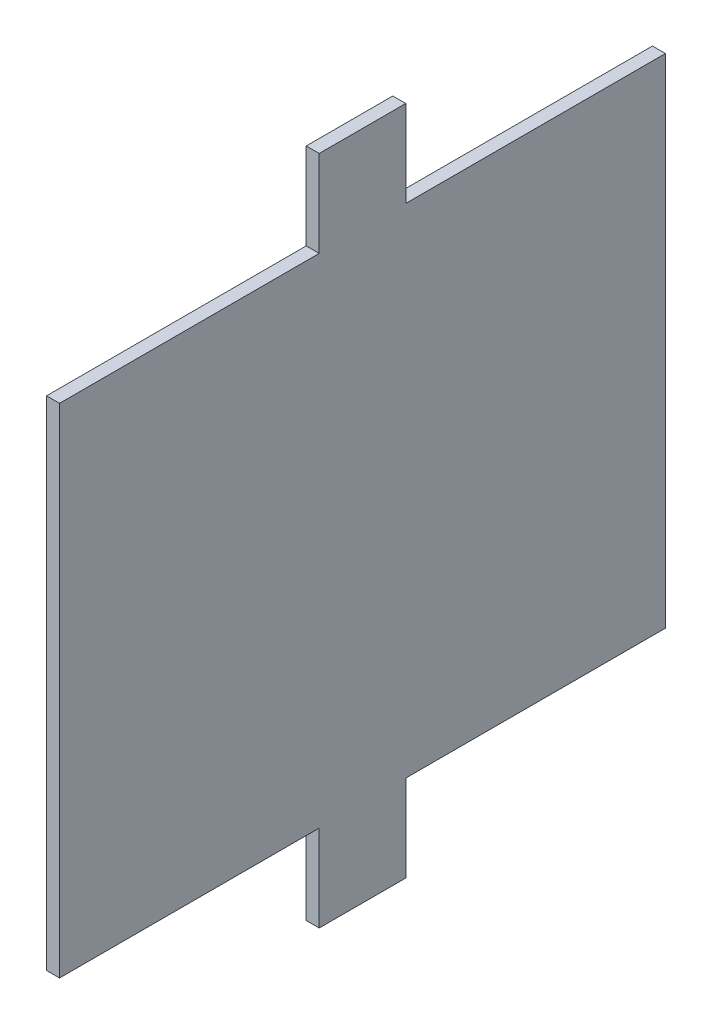
ISO-10303-21;
HEADER;
FILE_DESCRIPTION(('STEP AP214'),'2;1');
FILE_NAME('part.step','',(''),(''),'','','');
FILE_SCHEMA(('AUTOMOTIVE_DESIGN { 1 0 10303 214 1 1 1 1 }'));
ENDSEC;
DATA;
#1=APPLICATION_CONTEXT('core data for automotive mechanical design processes');
#2=APPLICATION_PROTOCOL_DEFINITION('international standard','automotive_design',2000,#1);
#3=PRODUCT_CONTEXT('',#1,'mechanical');
#4=PRODUCT('Part','Part','',(#3));
#5=PRODUCT_RELATED_PRODUCT_CATEGORY('part','',(#4));
#6=PRODUCT_DEFINITION_FORMATION('','',#4);
#7=PRODUCT_DEFINITION_CONTEXT('part definition',#1,'design');
#8=PRODUCT_DEFINITION('design','',#6,#7);
#9=PRODUCT_DEFINITION_SHAPE('','',#8);
#10=(LENGTH_UNIT() NAMED_UNIT(*) SI_UNIT(.MILLI.,.METRE.));
#11=(NAMED_UNIT(*) PLANE_ANGLE_UNIT() SI_UNIT($,.RADIAN.));
#12=(NAMED_UNIT(*) SI_UNIT($,.STERADIAN.) SOLID_ANGLE_UNIT());
#13=UNCERTAINTY_MEASURE_WITH_UNIT(LENGTH_MEASURE(1.E-05),#10,'distance_accuracy_value','');
#14=(GEOMETRIC_REPRESENTATION_CONTEXT(3) GLOBAL_UNCERTAINTY_ASSIGNED_CONTEXT((#13)) GLOBAL_UNIT_ASSIGNED_CONTEXT((#10,
#11,#12)) REPRESENTATION_CONTEXT('',''));
#15=CARTESIAN_POINT('',(0.,0.,0.));
#16=DIRECTION('',(0.,0.,1.));
#17=DIRECTION('',(1.,0.,0.));
#18=AXIS2_PLACEMENT_3D('',#15,#16,#17);
#19=CARTESIAN_POINT('',(3.81,200.822843489905,154.488603488026));
#20=DIRECTION('',(0.,0.,-1.));
#21=DIRECTION('',(-1.,0.,0.));
#22=AXIS2_PLACEMENT_3D('',#19,#20,#21);
#23=PLANE('',#22);
#24=DIRECTION('',(0.,-1.,0.));
#25=VECTOR('',#24,1.);
#26=CARTESIAN_POINT('',(-3.81,200.822843489905,154.488603488026));
#27=LINE('',#26,#25);
#28=CARTESIAN_POINT('',(-3.81,200.822843489905,154.488603488026));
#29=VERTEX_POINT('',#28);
#30=CARTESIAN_POINT('',(-3.81,-91.2771565100952,154.488603488026));
#31=VERTEX_POINT('',#30);
#32=EDGE_CURVE('E164',#29,#31,#27,.T.);
#33=ORIENTED_EDGE('',*,*,#32,.T.);
#34=DIRECTION('',(-1.,0.,0.));
#35=VECTOR('',#34,1.);
#36=CARTESIAN_POINT('',(3.81,-91.2771565100952,154.488603488026));
#37=LINE('',#36,#35);
#38=CARTESIAN_POINT('',(3.81,-91.2771565100952,154.488603488026));
#39=VERTEX_POINT('',#38);
#40=EDGE_CURVE('E11',#39,#31,#37,.T.);
#41=ORIENTED_EDGE('',*,*,#40,.F.);
#42=DIRECTION('',(0.,-1.,0.));
#43=VECTOR('',#42,1.);
#44=CARTESIAN_POINT('',(3.81,200.822843489905,154.488603488026));
#45=LINE('',#44,#43);
#46=CARTESIAN_POINT('',(3.81,200.822843489905,154.488603488026));
#47=VERTEX_POINT('',#46);
#48=EDGE_CURVE('E198',#47,#39,#45,.T.);
#49=ORIENTED_EDGE('',*,*,#48,.F.);
#50=DIRECTION('',(-1.,0.,0.));
#51=VECTOR('',#50,1.);
#52=CARTESIAN_POINT('',(3.81,200.822843489905,154.488603488026));
#53=LINE('',#52,#51);
#54=EDGE_CURVE('E160',#47,#29,#53,.T.);
#55=ORIENTED_EDGE('',*,*,#54,.T.);
#56=EDGE_LOOP('',(#33,#41,#49,#55));
#57=FACE_BOUND('',#56,.T.);
#58=ADVANCED_FACE('F39',(#57),#23,.F.);
#59=CARTESIAN_POINT('',(3.81,-91.2771565100952,154.488603488026));
#60=DIRECTION('',(0.,1.,0.));
#61=DIRECTION('',(0.,0.,1.));
#62=AXIS2_PLACEMENT_3D('',#59,#60,#61);
#63=PLANE('',#62);
#64=DIRECTION('',(0.,0.,-1.));
#65=VECTOR('',#64,1.);
#66=CARTESIAN_POINT('',(-3.81,-91.2771565100952,154.488603488026));
#67=LINE('',#66,#65);
#68=CARTESIAN_POINT('',(-3.81,-91.2771565100952,2.08860348802573));
#69=VERTEX_POINT('',#68);
#70=EDGE_CURVE('E168',#31,#69,#67,.T.);
#71=ORIENTED_EDGE('',*,*,#70,.T.);
#72=DIRECTION('',(-1.,0.,0.));
#73=VECTOR('',#72,1.);
#74=CARTESIAN_POINT('',(3.81,-91.2771565100952,2.08860348802573));
#75=LINE('',#74,#73);
#76=CARTESIAN_POINT('',(3.81,-91.2771565100952,2.08860348802573));
#77=VERTEX_POINT('',#76);
#78=EDGE_CURVE('E48',#77,#69,#75,.T.);
#79=ORIENTED_EDGE('',*,*,#78,.F.);
#80=DIRECTION('',(0.,0.,-1.));
#81=VECTOR('',#80,1.);
#82=CARTESIAN_POINT('',(3.81,-91.2771565100952,154.488603488026));
#83=LINE('',#82,#81);
#84=EDGE_CURVE('E111',#39,#77,#83,.T.);
#85=ORIENTED_EDGE('',*,*,#84,.F.);
#86=ORIENTED_EDGE('',*,*,#40,.T.);
#87=EDGE_LOOP('',(#71,#79,#85,#86));
#88=FACE_BOUND('',#87,.T.);
#89=ADVANCED_FACE('F292',(#88),#63,.F.);
#90=CARTESIAN_POINT('',(3.81,-142.077156510095,2.08860348802573));
#91=DIRECTION('',(0.,0.,-1.));
#92=DIRECTION('',(-1.,0.,0.));
#93=AXIS2_PLACEMENT_3D('',#90,#91,#92);
#94=PLANE('',#93);
#95=DIRECTION('',(0.,-1.,0.));
#96=VECTOR('',#95,1.);
#97=CARTESIAN_POINT('',(-3.81,-142.077156510095,2.08860348802573));
#98=LINE('',#97,#96);
#99=CARTESIAN_POINT('',(-3.81,-142.077156510095,2.08860348802573));
#100=VERTEX_POINT('',#99);
#101=EDGE_CURVE('E171',#69,#100,#98,.T.);
#102=ORIENTED_EDGE('',*,*,#101,.T.);
#103=DIRECTION('',(-1.,0.,0.));
#104=VECTOR('',#103,1.);
#105=CARTESIAN_POINT('',(3.81,-142.077156510095,2.08860348802573));
#106=LINE('',#105,#104);
#107=CARTESIAN_POINT('',(3.81,-142.077156510095,2.08860348802573));
#108=VERTEX_POINT('',#107);
#109=EDGE_CURVE('E225',#108,#100,#106,.T.);
#110=ORIENTED_EDGE('',*,*,#109,.F.);
#111=DIRECTION('',(0.,-1.,0.));
#112=VECTOR('',#111,1.);
#113=CARTESIAN_POINT('',(3.81,-142.077156510095,2.08860348802573));
#114=LINE('',#113,#112);
#115=EDGE_CURVE('E235',#77,#108,#114,.T.);
#116=ORIENTED_EDGE('',*,*,#115,.F.);
#117=ORIENTED_EDGE('',*,*,#78,.T.);
#118=EDGE_LOOP('',(#102,#110,#116,#117));
#119=FACE_BOUND('',#118,.T.);
#120=ADVANCED_FACE('F233',(#119),#94,.F.);
#121=CARTESIAN_POINT('',(3.81,-142.077156510095,-48.7113965119743));
#122=DIRECTION('',(0.,1.,0.));
#123=DIRECTION('',(0.,0.,1.));
#124=AXIS2_PLACEMENT_3D('',#121,#122,#123);
#125=PLANE('',#124);
#126=DIRECTION('',(0.,0.,-1.));
#127=VECTOR('',#126,1.);
#128=CARTESIAN_POINT('',(-3.81,-142.077156510095,-48.7113965119743));
#129=LINE('',#128,#127);
#130=CARTESIAN_POINT('',(-3.81,-142.077156510095,-48.7113965119743));
#131=VERTEX_POINT('',#130);
#132=EDGE_CURVE('E174',#100,#131,#129,.T.);
#133=ORIENTED_EDGE('',*,*,#132,.T.);
#134=DIRECTION('',(-1.,0.,0.));
#135=VECTOR('',#134,1.);
#136=CARTESIAN_POINT('',(3.81,-142.077156510095,-48.7113965119743));
#137=LINE('',#136,#135);
#138=CARTESIAN_POINT('',(3.81,-142.077156510095,-48.7113965119743));
#139=VERTEX_POINT('',#138);
#140=EDGE_CURVE('E221',#139,#131,#137,.T.);
#141=ORIENTED_EDGE('',*,*,#140,.F.);
#142=DIRECTION('',(0.,0.,-1.));
#143=VECTOR('',#142,1.);
#144=CARTESIAN_POINT('',(3.81,-142.077156510095,-48.7113965119743));
#145=LINE('',#144,#143);
#146=EDGE_CURVE('E254',#108,#139,#145,.T.);
#147=ORIENTED_EDGE('',*,*,#146,.F.);
#148=ORIENTED_EDGE('',*,*,#109,.T.);
#149=EDGE_LOOP('',(#133,#141,#147,#148));
#150=FACE_BOUND('',#149,.T.);
#151=ADVANCED_FACE('F244',(#150),#125,.F.);
#152=CARTESIAN_POINT('',(3.81,-91.2771565100952,-48.7113965119743));
#153=DIRECTION('',(0.,0.,1.));
#154=DIRECTION('',(0.,-1.,0.));
#155=AXIS2_PLACEMENT_3D('',#152,#153,#154);
#156=PLANE('',#155);
#157=DIRECTION('',(0.,1.,0.));
#158=VECTOR('',#157,1.);
#159=CARTESIAN_POINT('',(-3.81,-91.2771565100952,-48.7113965119743));
#160=LINE('',#159,#158);
#161=CARTESIAN_POINT('',(-3.81,-91.2771565100952,-48.7113965119743));
#162=VERTEX_POINT('',#161);
#163=EDGE_CURVE('E177',#131,#162,#160,.T.);
#164=ORIENTED_EDGE('',*,*,#163,.T.);
#165=DIRECTION('',(-1.,0.,0.));
#166=VECTOR('',#165,1.);
#167=CARTESIAN_POINT('',(3.81,-91.2771565100952,-48.7113965119743));
#168=LINE('',#167,#166);
#169=CARTESIAN_POINT('',(3.81,-91.2771565100952,-48.7113965119743));
#170=VERTEX_POINT('',#169);
#171=EDGE_CURVE('E217',#170,#162,#168,.T.);
#172=ORIENTED_EDGE('',*,*,#171,.F.);
#173=DIRECTION('',(0.,1.,0.));
#174=VECTOR('',#173,1.);
#175=CARTESIAN_POINT('',(3.81,-91.2771565100952,-48.7113965119743));
#176=LINE('',#175,#174);
#177=EDGE_CURVE('E250',#139,#170,#176,.T.);
#178=ORIENTED_EDGE('',*,*,#177,.F.);
#179=ORIENTED_EDGE('',*,*,#140,.T.);
#180=EDGE_LOOP('',(#164,#172,#178,#179));
#181=FACE_BOUND('',#180,.T.);
#182=ADVANCED_FACE('F248',(#181),#156,.F.);
#183=CARTESIAN_POINT('',(3.81,-91.2771565100952,-48.7113965119743));
#184=DIRECTION('',(0.,1.,0.));
#185=DIRECTION('',(0.,0.,1.));
#186=AXIS2_PLACEMENT_3D('',#183,#184,#185);
#187=PLANE('',#186);
#188=DIRECTION('',(0.,0.,-1.));
#189=VECTOR('',#188,1.);
#190=CARTESIAN_POINT('',(-3.81,-91.2771565100952,-48.7113965119743));
#191=LINE('',#190,#189);
#192=CARTESIAN_POINT('',(-3.81,-91.2771565100952,-201.111396511974));
#193=VERTEX_POINT('',#192);
#194=EDGE_CURVE('E180',#162,#193,#191,.T.);
#195=ORIENTED_EDGE('',*,*,#194,.T.);
#196=DIRECTION('',(-1.,0.,0.));
#197=VECTOR('',#196,1.);
#198=CARTESIAN_POINT('',(3.81,-91.2771565100952,-201.111396511974));
#199=LINE('',#198,#197);
#200=CARTESIAN_POINT('',(3.81,-91.2771565100952,-201.111396511974));
#201=VERTEX_POINT('',#200);
#202=EDGE_CURVE('E213',#201,#193,#199,.T.);
#203=ORIENTED_EDGE('',*,*,#202,.F.);
#204=DIRECTION('',(0.,0.,-1.));
#205=VECTOR('',#204,1.);
#206=CARTESIAN_POINT('',(3.81,-91.2771565100952,-48.7113965119743));
#207=LINE('',#206,#205);
#208=EDGE_CURVE('E253',#170,#201,#207,.T.);
#209=ORIENTED_EDGE('',*,*,#208,.F.);
#210=ORIENTED_EDGE('',*,*,#171,.T.);
#211=EDGE_LOOP('',(#195,#203,#209,#210));
#212=FACE_BOUND('',#211,.T.);
#213=ADVANCED_FACE('F305',(#212),#187,.F.);
#214=CARTESIAN_POINT('',(3.81,200.822843489905,-201.111396511974));
#215=DIRECTION('',(0.,0.,1.));
#216=DIRECTION('',(0.,-1.,0.));
#217=AXIS2_PLACEMENT_3D('',#214,#215,#216);
#218=PLANE('',#217);
#219=DIRECTION('',(0.,1.,0.));
#220=VECTOR('',#219,1.);
#221=CARTESIAN_POINT('',(-3.81,200.822843489905,-201.111396511974));
#222=LINE('',#221,#220);
#223=CARTESIAN_POINT('',(-3.81,200.822843489905,-201.111396511974));
#224=VERTEX_POINT('',#223);
#225=EDGE_CURVE('E183',#193,#224,#222,.T.);
#226=ORIENTED_EDGE('',*,*,#225,.T.);
#227=DIRECTION('',(-1.,0.,0.));
#228=VECTOR('',#227,1.);
#229=CARTESIAN_POINT('',(3.81,200.822843489905,-201.111396511974));
#230=LINE('',#229,#228);
#231=CARTESIAN_POINT('',(3.81,200.822843489905,-201.111396511974));
#232=VERTEX_POINT('',#231);
#233=EDGE_CURVE('E209',#232,#224,#230,.T.);
#234=ORIENTED_EDGE('',*,*,#233,.F.);
#235=DIRECTION('',(0.,1.,0.));
#236=VECTOR('',#235,1.);
#237=CARTESIAN_POINT('',(3.81,200.822843489905,-201.111396511974));
#238=LINE('',#237,#236);
#239=EDGE_CURVE('E258',#201,#232,#238,.T.);
#240=ORIENTED_EDGE('',*,*,#239,.F.);
#241=ORIENTED_EDGE('',*,*,#202,.T.);
#242=EDGE_LOOP('',(#226,#234,#240,#241));
#243=FACE_BOUND('',#242,.T.);
#244=ADVANCED_FACE('F308',(#243),#218,.F.);
#245=CARTESIAN_POINT('',(3.81,200.822843489905,-48.7113965119742));
#246=DIRECTION('',(0.,-1.,0.));
#247=DIRECTION('',(0.,0.,-1.));
#248=AXIS2_PLACEMENT_3D('',#245,#246,#247);
#249=PLANE('',#248);
#250=DIRECTION('',(0.,0.,1.));
#251=VECTOR('',#250,1.);
#252=CARTESIAN_POINT('',(-3.81,200.822843489905,-48.7113965119742));
#253=LINE('',#252,#251);
#254=CARTESIAN_POINT('',(-3.81,200.822843489905,-48.7113965119742));
#255=VERTEX_POINT('',#254);
#256=EDGE_CURVE('E186',#224,#255,#253,.T.);
#257=ORIENTED_EDGE('',*,*,#256,.T.);
#258=DIRECTION('',(-1.,0.,0.));
#259=VECTOR('',#258,1.);
#260=CARTESIAN_POINT('',(3.81,200.822843489905,-48.7113965119742));
#261=LINE('',#260,#259);
#262=CARTESIAN_POINT('',(3.81,200.822843489905,-48.7113965119742));
#263=VERTEX_POINT('',#262);
#264=EDGE_CURVE('E205',#263,#255,#261,.T.);
#265=ORIENTED_EDGE('',*,*,#264,.F.);
#266=DIRECTION('',(0.,0.,1.));
#267=VECTOR('',#266,1.);
#268=CARTESIAN_POINT('',(3.81,200.822843489905,-48.7113965119742));
#269=LINE('',#268,#267);
#270=EDGE_CURVE('E265',#232,#263,#269,.T.);
#271=ORIENTED_EDGE('',*,*,#270,.F.);
#272=ORIENTED_EDGE('',*,*,#233,.T.);
#273=EDGE_LOOP('',(#257,#265,#271,#272));
#274=FACE_BOUND('',#273,.T.);
#275=ADVANCED_FACE('F273',(#274),#249,.F.);
#276=CARTESIAN_POINT('',(3.81,200.822843489905,-48.7113965119742));
#277=DIRECTION('',(0.,0.,1.));
#278=DIRECTION('',(1.,0.,0.));
#279=AXIS2_PLACEMENT_3D('',#276,#277,#278);
#280=PLANE('',#279);
#281=DIRECTION('',(0.,1.,0.));
#282=VECTOR('',#281,1.);
#283=CARTESIAN_POINT('',(-3.81,200.822843489905,-48.7113965119742));
#284=LINE('',#283,#282);
#285=CARTESIAN_POINT('',(-3.81,251.622843489905,-48.7113965119742));
#286=VERTEX_POINT('',#285);
#287=EDGE_CURVE('E189',#255,#286,#284,.T.);
#288=ORIENTED_EDGE('',*,*,#287,.T.);
#289=DIRECTION('',(-1.,0.,0.));
#290=VECTOR('',#289,1.);
#291=CARTESIAN_POINT('',(3.81,251.622843489905,-48.7113965119742));
#292=LINE('',#291,#290);
#293=CARTESIAN_POINT('',(3.81,251.622843489905,-48.7113965119742));
#294=VERTEX_POINT('',#293);
#295=EDGE_CURVE('E153',#294,#286,#292,.T.);
#296=ORIENTED_EDGE('',*,*,#295,.F.);
#297=DIRECTION('',(0.,1.,0.));
#298=VECTOR('',#297,1.);
#299=CARTESIAN_POINT('',(3.81,200.822843489905,-48.7113965119742));
#300=LINE('',#299,#298);
#301=EDGE_CURVE('E142',#263,#294,#300,.T.);
#302=ORIENTED_EDGE('',*,*,#301,.F.);
#303=ORIENTED_EDGE('',*,*,#264,.T.);
#304=EDGE_LOOP('',(#288,#296,#302,#303));
#305=FACE_BOUND('',#304,.T.);
#306=ADVANCED_FACE('F277',(#305),#280,.F.);
#307=CARTESIAN_POINT('',(3.81,251.622843489905,-48.7113965119742));
#308=DIRECTION('',(0.,-1.,0.));
#309=DIRECTION('',(0.,0.,-1.));
#310=AXIS2_PLACEMENT_3D('',#307,#308,#309);
#311=PLANE('',#310);
#312=DIRECTION('',(0.,0.,1.));
#313=VECTOR('',#312,1.);
#314=CARTESIAN_POINT('',(-3.81,251.622843489905,-48.7113965119742));
#315=LINE('',#314,#313);
#316=CARTESIAN_POINT('',(-3.81,251.622843489905,2.08860348802578));
#317=VERTEX_POINT('',#316);
#318=EDGE_CURVE('E151',#286,#317,#315,.T.);
#319=ORIENTED_EDGE('',*,*,#318,.T.);
#320=DIRECTION('',(-1.,0.,0.));
#321=VECTOR('',#320,1.);
#322=CARTESIAN_POINT('',(3.81,251.622843489905,2.08860348802578));
#323=LINE('',#322,#321);
#324=CARTESIAN_POINT('',(3.81,251.622843489905,2.08860348802578));
#325=VERTEX_POINT('',#324);
#326=EDGE_CURVE('E148',#325,#317,#323,.T.);
#327=ORIENTED_EDGE('',*,*,#326,.F.);
#328=DIRECTION('',(0.,0.,1.));
#329=VECTOR('',#328,1.);
#330=CARTESIAN_POINT('',(3.81,251.622843489905,-48.7113965119742));
#331=LINE('',#330,#329);
#332=EDGE_CURVE('E136',#294,#325,#331,.T.);
#333=ORIENTED_EDGE('',*,*,#332,.F.);
#334=ORIENTED_EDGE('',*,*,#295,.T.);
#335=EDGE_LOOP('',(#319,#327,#333,#334));
#336=FACE_BOUND('',#335,.T.);
#337=ADVANCED_FACE('F149',(#336),#311,.F.);
#338=CARTESIAN_POINT('',(3.81,251.622843489905,2.08860348802578));
#339=DIRECTION('',(0.,0.,-1.));
#340=DIRECTION('',(0.,1.,0.));
#341=AXIS2_PLACEMENT_3D('',#338,#339,#340);
#342=PLANE('',#341);
#343=DIRECTION('',(0.,-1.,0.));
#344=VECTOR('',#343,1.);
#345=CARTESIAN_POINT('',(-3.81,251.622843489905,2.08860348802578));
#346=LINE('',#345,#344);
#347=CARTESIAN_POINT('',(-3.81,200.822843489905,2.08860348802578));
#348=VERTEX_POINT('',#347);
#349=EDGE_CURVE('E97',#317,#348,#346,.T.);
#350=ORIENTED_EDGE('',*,*,#349,.T.);
#351=DIRECTION('',(-1.,0.,0.));
#352=VECTOR('',#351,1.);
#353=CARTESIAN_POINT('',(3.81,200.822843489905,2.08860348802578));
#354=LINE('',#353,#352);
#355=CARTESIAN_POINT('',(3.81,200.822843489905,2.08860348802578));
#356=VERTEX_POINT('',#355);
#357=EDGE_CURVE('E154',#356,#348,#354,.T.);
#358=ORIENTED_EDGE('',*,*,#357,.F.);
#359=DIRECTION('',(0.,-1.,0.));
#360=VECTOR('',#359,1.);
#361=CARTESIAN_POINT('',(3.81,251.622843489905,2.08860348802578));
#362=LINE('',#361,#360);
#363=EDGE_CURVE('E140',#325,#356,#362,.T.);
#364=ORIENTED_EDGE('',*,*,#363,.F.);
#365=ORIENTED_EDGE('',*,*,#326,.T.);
#366=EDGE_LOOP('',(#350,#358,#364,#365));
#367=FACE_BOUND('',#366,.T.);
#368=ADVANCED_FACE('F156',(#367),#342,.F.);
#369=CARTESIAN_POINT('',(3.81,200.822843489905,154.488603488026));
#370=DIRECTION('',(0.,-1.,0.));
#371=DIRECTION('',(0.,0.,-1.));
#372=AXIS2_PLACEMENT_3D('',#369,#370,#371);
#373=PLANE('',#372);
#374=DIRECTION('',(0.,0.,1.));
#375=VECTOR('',#374,1.);
#376=CARTESIAN_POINT('',(-3.81,200.822843489905,154.488603488026));
#377=LINE('',#376,#375);
#378=EDGE_CURVE('E103',#348,#29,#377,.T.);
#379=ORIENTED_EDGE('',*,*,#378,.T.);
#380=ORIENTED_EDGE('',*,*,#54,.F.);
#381=DIRECTION('',(0.,0.,1.));
#382=VECTOR('',#381,1.);
#383=CARTESIAN_POINT('',(3.81,200.822843489905,154.488603488026));
#384=LINE('',#383,#382);
#385=EDGE_CURVE('E56',#356,#47,#384,.T.);
#386=ORIENTED_EDGE('',*,*,#385,.F.);
#387=ORIENTED_EDGE('',*,*,#357,.T.);
#388=EDGE_LOOP('',(#379,#380,#386,#387));
#389=FACE_BOUND('',#388,.T.);
#390=ADVANCED_FACE('F281',(#389),#373,.F.);
#391=CARTESIAN_POINT('',(3.81,0.,0.));
#392=DIRECTION('',(1.,0.,0.));
#393=DIRECTION('',(0.,0.,-1.));
#394=AXIS2_PLACEMENT_3D('',#391,#392,#393);
#395=PLANE('',#394);
#396=ORIENTED_EDGE('',*,*,#48,.T.);
#397=ORIENTED_EDGE('',*,*,#84,.T.);
#398=ORIENTED_EDGE('',*,*,#115,.T.);
#399=ORIENTED_EDGE('',*,*,#146,.T.);
#400=ORIENTED_EDGE('',*,*,#177,.T.);
#401=ORIENTED_EDGE('',*,*,#208,.T.);
#402=ORIENTED_EDGE('',*,*,#239,.T.);
#403=ORIENTED_EDGE('',*,*,#270,.T.);
#404=ORIENTED_EDGE('',*,*,#301,.T.);
#405=ORIENTED_EDGE('',*,*,#332,.T.);
#406=ORIENTED_EDGE('',*,*,#363,.T.);
#407=ORIENTED_EDGE('',*,*,#385,.T.);
#408=EDGE_LOOP('',(#396,#397,#398,#399,#400,#401,#402,#403,#404,#405,#406,#407));
#409=FACE_BOUND('',#408,.T.);
#410=ADVANCED_FACE('F138',(#409),#395,.T.);
#411=CARTESIAN_POINT('',(-3.81,0.,0.));
#412=DIRECTION('',(1.,0.,0.));
#413=DIRECTION('',(0.,0.,-1.));
#414=AXIS2_PLACEMENT_3D('',#411,#412,#413);
#415=PLANE('',#414);
#416=ORIENTED_EDGE('',*,*,#32,.F.);
#417=ORIENTED_EDGE('',*,*,#378,.F.);
#418=ORIENTED_EDGE('',*,*,#349,.F.);
#419=ORIENTED_EDGE('',*,*,#318,.F.);
#420=ORIENTED_EDGE('',*,*,#287,.F.);
#421=ORIENTED_EDGE('',*,*,#256,.F.);
#422=ORIENTED_EDGE('',*,*,#225,.F.);
#423=ORIENTED_EDGE('',*,*,#194,.F.);
#424=ORIENTED_EDGE('',*,*,#163,.F.);
#425=ORIENTED_EDGE('',*,*,#132,.F.);
#426=ORIENTED_EDGE('',*,*,#101,.F.);
#427=ORIENTED_EDGE('',*,*,#70,.F.);
#428=EDGE_LOOP('',(#416,#417,#418,#419,#420,#421,#422,#423,#424,#425,#426,#427));
#429=FACE_BOUND('',#428,.T.);
#430=ADVANCED_FACE('F239',(#429),#415,.F.);
#431=CLOSED_SHELL('',(#58,#89,#120,#151,#182,#213,#244,#275,#306,#337,#368,#390,#410,#430));
#432=MANIFOLD_SOLID_BREP('B2',#431);
#433=ADVANCED_BREP_SHAPE_REPRESENTATION('',(#18,#432),#14);
#434=SHAPE_DEFINITION_REPRESENTATION(#9,#433);
ENDSEC;
END-ISO-10303-21;
